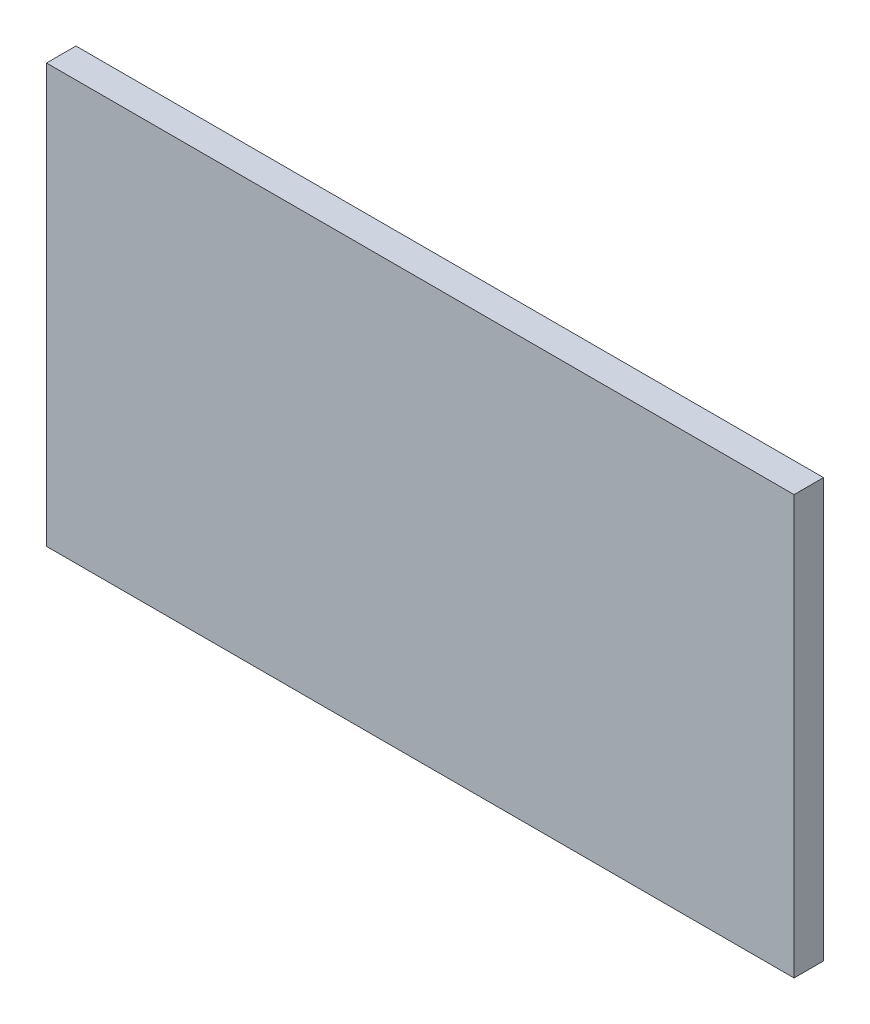
ISO-10303-21;
HEADER;
FILE_DESCRIPTION(('STEP AP214'),'2;1');
FILE_NAME('part.step','',(''),(''),'','','');
FILE_SCHEMA(('AUTOMOTIVE_DESIGN { 1 0 10303 214 1 1 1 1 }'));
ENDSEC;
DATA;
#1=APPLICATION_CONTEXT('core data for automotive mechanical design processes');
#2=APPLICATION_PROTOCOL_DEFINITION('international standard','automotive_design',2000,#1);
#3=PRODUCT_CONTEXT('',#1,'mechanical');
#4=PRODUCT('Part','Part','',(#3));
#5=PRODUCT_RELATED_PRODUCT_CATEGORY('part','',(#4));
#6=PRODUCT_DEFINITION_FORMATION('','',#4);
#7=PRODUCT_DEFINITION_CONTEXT('part definition',#1,'design');
#8=PRODUCT_DEFINITION('design','',#6,#7);
#9=PRODUCT_DEFINITION_SHAPE('','',#8);
#10=(LENGTH_UNIT() NAMED_UNIT(*) SI_UNIT(.MILLI.,.METRE.));
#11=(NAMED_UNIT(*) PLANE_ANGLE_UNIT() SI_UNIT($,.RADIAN.));
#12=(NAMED_UNIT(*) SI_UNIT($,.STERADIAN.) SOLID_ANGLE_UNIT());
#13=UNCERTAINTY_MEASURE_WITH_UNIT(LENGTH_MEASURE(1.E-05),#10,'distance_accuracy_value','');
#14=(GEOMETRIC_REPRESENTATION_CONTEXT(3) GLOBAL_UNCERTAINTY_ASSIGNED_CONTEXT((#13)) GLOBAL_UNIT_ASSIGNED_CONTEXT((#10,
#11,#12)) REPRESENTATION_CONTEXT('',''));
#15=CARTESIAN_POINT('',(0.,0.,0.));
#16=DIRECTION('',(0.,0.,1.));
#17=DIRECTION('',(1.,0.,0.));
#18=AXIS2_PLACEMENT_3D('',#15,#16,#17);
#19=CARTESIAN_POINT('',(25.4,-14.224,2.));
#20=DIRECTION('',(-1.,0.,0.));
#21=DIRECTION('',(0.,0.,1.));
#22=AXIS2_PLACEMENT_3D('',#19,#20,#21);
#23=PLANE('',#22);
#24=DIRECTION('',(0.,1.,0.));
#25=VECTOR('',#24,1.);
#26=CARTESIAN_POINT('',(25.4,-14.224,0.));
#27=LINE('',#26,#25);
#28=CARTESIAN_POINT('',(25.4,-14.224,0.));
#29=VERTEX_POINT('',#28);
#30=CARTESIAN_POINT('',(25.4,14.224,0.));
#31=VERTEX_POINT('',#30);
#32=EDGE_CURVE('E109',#29,#31,#27,.T.);
#33=ORIENTED_EDGE('',*,*,#32,.T.);
#34=DIRECTION('',(0.,0.,-1.));
#35=VECTOR('',#34,1.);
#36=CARTESIAN_POINT('',(25.4,14.224,2.));
#37=LINE('',#36,#35);
#38=CARTESIAN_POINT('',(25.4,14.224,2.));
#39=VERTEX_POINT('',#38);
#40=EDGE_CURVE('E11',#39,#31,#37,.T.);
#41=ORIENTED_EDGE('',*,*,#40,.F.);
#42=DIRECTION('',(0.,1.,0.));
#43=VECTOR('',#42,1.);
#44=CARTESIAN_POINT('',(25.4,-14.224,2.));
#45=LINE('',#44,#43);
#46=CARTESIAN_POINT('',(25.4,-14.224,2.));
#47=VERTEX_POINT('',#46);
#48=EDGE_CURVE('E93',#47,#39,#45,.T.);
#49=ORIENTED_EDGE('',*,*,#48,.F.);
#50=DIRECTION('',(0.,0.,-1.));
#51=VECTOR('',#50,1.);
#52=CARTESIAN_POINT('',(25.4,-14.224,2.));
#53=LINE('',#52,#51);
#54=EDGE_CURVE('E105',#47,#29,#53,.T.);
#55=ORIENTED_EDGE('',*,*,#54,.T.);
#56=EDGE_LOOP('',(#33,#41,#49,#55));
#57=FACE_BOUND('',#56,.T.);
#58=ADVANCED_FACE('F41',(#57),#23,.F.);
#59=CARTESIAN_POINT('',(-25.4,14.224,2.));
#60=DIRECTION('',(0.,-1.,0.));
#61=DIRECTION('',(0.,0.,-1.));
#62=AXIS2_PLACEMENT_3D('',#59,#60,#61);
#63=PLANE('',#62);
#64=DIRECTION('',(-1.,0.,0.));
#65=VECTOR('',#64,1.);
#66=CARTESIAN_POINT('',(-25.4,14.224,0.));
#67=LINE('',#66,#65);
#68=CARTESIAN_POINT('',(-25.4,14.224,0.));
#69=VERTEX_POINT('',#68);
#70=EDGE_CURVE('E98',#31,#69,#67,.T.);
#71=ORIENTED_EDGE('',*,*,#70,.T.);
#72=DIRECTION('',(0.,0.,-1.));
#73=VECTOR('',#72,1.);
#74=CARTESIAN_POINT('',(-25.4,14.224,2.));
#75=LINE('',#74,#73);
#76=CARTESIAN_POINT('',(-25.4,14.224,2.));
#77=VERTEX_POINT('',#76);
#78=EDGE_CURVE('E50',#77,#69,#75,.T.);
#79=ORIENTED_EDGE('',*,*,#78,.F.);
#80=DIRECTION('',(-1.,0.,0.));
#81=VECTOR('',#80,1.);
#82=CARTESIAN_POINT('',(-25.4,14.224,2.));
#83=LINE('',#82,#81);
#84=EDGE_CURVE('E88',#39,#77,#83,.T.);
#85=ORIENTED_EDGE('',*,*,#84,.F.);
#86=ORIENTED_EDGE('',*,*,#40,.T.);
#87=EDGE_LOOP('',(#71,#79,#85,#86));
#88=FACE_BOUND('',#87,.T.);
#89=ADVANCED_FACE('F97',(#88),#63,.F.);
#90=CARTESIAN_POINT('',(-25.4,-14.224,2.));
#91=DIRECTION('',(1.,0.,0.));
#92=DIRECTION('',(0.,0.,-1.));
#93=AXIS2_PLACEMENT_3D('',#90,#91,#92);
#94=PLANE('',#93);
#95=DIRECTION('',(0.,-1.,0.));
#96=VECTOR('',#95,1.);
#97=CARTESIAN_POINT('',(-25.4,-14.224,0.));
#98=LINE('',#97,#96);
#99=CARTESIAN_POINT('',(-25.4,-14.224,0.));
#100=VERTEX_POINT('',#99);
#101=EDGE_CURVE('E75',#69,#100,#98,.T.);
#102=ORIENTED_EDGE('',*,*,#101,.T.);
#103=DIRECTION('',(0.,0.,-1.));
#104=VECTOR('',#103,1.);
#105=CARTESIAN_POINT('',(-25.4,-14.224,2.));
#106=LINE('',#105,#104);
#107=CARTESIAN_POINT('',(-25.4,-14.224,2.));
#108=VERTEX_POINT('',#107);
#109=EDGE_CURVE('E100',#108,#100,#106,.T.);
#110=ORIENTED_EDGE('',*,*,#109,.F.);
#111=DIRECTION('',(0.,-1.,0.));
#112=VECTOR('',#111,1.);
#113=CARTESIAN_POINT('',(-25.4,-14.224,2.));
#114=LINE('',#113,#112);
#115=EDGE_CURVE('E91',#77,#108,#114,.T.);
#116=ORIENTED_EDGE('',*,*,#115,.F.);
#117=ORIENTED_EDGE('',*,*,#78,.T.);
#118=EDGE_LOOP('',(#102,#110,#116,#117));
#119=FACE_BOUND('',#118,.T.);
#120=ADVANCED_FACE('F101',(#119),#94,.F.);
#121=CARTESIAN_POINT('',(-25.4,-14.224,2.));
#122=DIRECTION('',(0.,1.,0.));
#123=DIRECTION('',(0.,0.,1.));
#124=AXIS2_PLACEMENT_3D('',#121,#122,#123);
#125=PLANE('',#124);
#126=DIRECTION('',(1.,0.,0.));
#127=VECTOR('',#126,1.);
#128=CARTESIAN_POINT('',(-25.4,-14.224,0.));
#129=LINE('',#128,#127);
#130=EDGE_CURVE('E81',#100,#29,#129,.T.);
#131=ORIENTED_EDGE('',*,*,#130,.T.);
#132=ORIENTED_EDGE('',*,*,#54,.F.);
#133=DIRECTION('',(1.,0.,0.));
#134=VECTOR('',#133,1.);
#135=CARTESIAN_POINT('',(-25.4,-14.224,2.));
#136=LINE('',#135,#134);
#137=EDGE_CURVE('E58',#108,#47,#136,.T.);
#138=ORIENTED_EDGE('',*,*,#137,.F.);
#139=ORIENTED_EDGE('',*,*,#109,.T.);
#140=EDGE_LOOP('',(#131,#132,#138,#139));
#141=FACE_BOUND('',#140,.T.);
#142=ADVANCED_FACE('F122',(#141),#125,.F.);
#143=CARTESIAN_POINT('',(0.,0.,2.));
#144=DIRECTION('',(0.,0.,-1.));
#145=DIRECTION('',(-1.,0.,0.));
#146=AXIS2_PLACEMENT_3D('',#143,#144,#145);
#147=PLANE('',#146);
#148=ORIENTED_EDGE('',*,*,#48,.T.);
#149=ORIENTED_EDGE('',*,*,#84,.T.);
#150=ORIENTED_EDGE('',*,*,#115,.T.);
#151=ORIENTED_EDGE('',*,*,#137,.T.);
#152=EDGE_LOOP('',(#148,#149,#150,#151));
#153=FACE_BOUND('',#152,.T.);
#154=ADVANCED_FACE('F89',(#153),#147,.F.);
#155=CARTESIAN_POINT('',(0.,0.,0.));
#156=DIRECTION('',(0.,0.,-1.));
#157=DIRECTION('',(-1.,0.,0.));
#158=AXIS2_PLACEMENT_3D('',#155,#156,#157);
#159=PLANE('',#158);
#160=ORIENTED_EDGE('',*,*,#32,.F.);
#161=ORIENTED_EDGE('',*,*,#130,.F.);
#162=ORIENTED_EDGE('',*,*,#101,.F.);
#163=ORIENTED_EDGE('',*,*,#70,.F.);
#164=EDGE_LOOP('',(#160,#161,#162,#163));
#165=FACE_BOUND('',#164,.T.);
#166=ADVANCED_FACE('F125',(#165),#159,.T.);
#167=CLOSED_SHELL('',(#58,#89,#120,#142,#154,#166));
#168=MANIFOLD_SOLID_BREP('B2',#167);
#169=ADVANCED_BREP_SHAPE_REPRESENTATION('',(#18,#168),#14);
#170=SHAPE_DEFINITION_REPRESENTATION(#9,#169);
ENDSEC;
END-ISO-10303-21;
